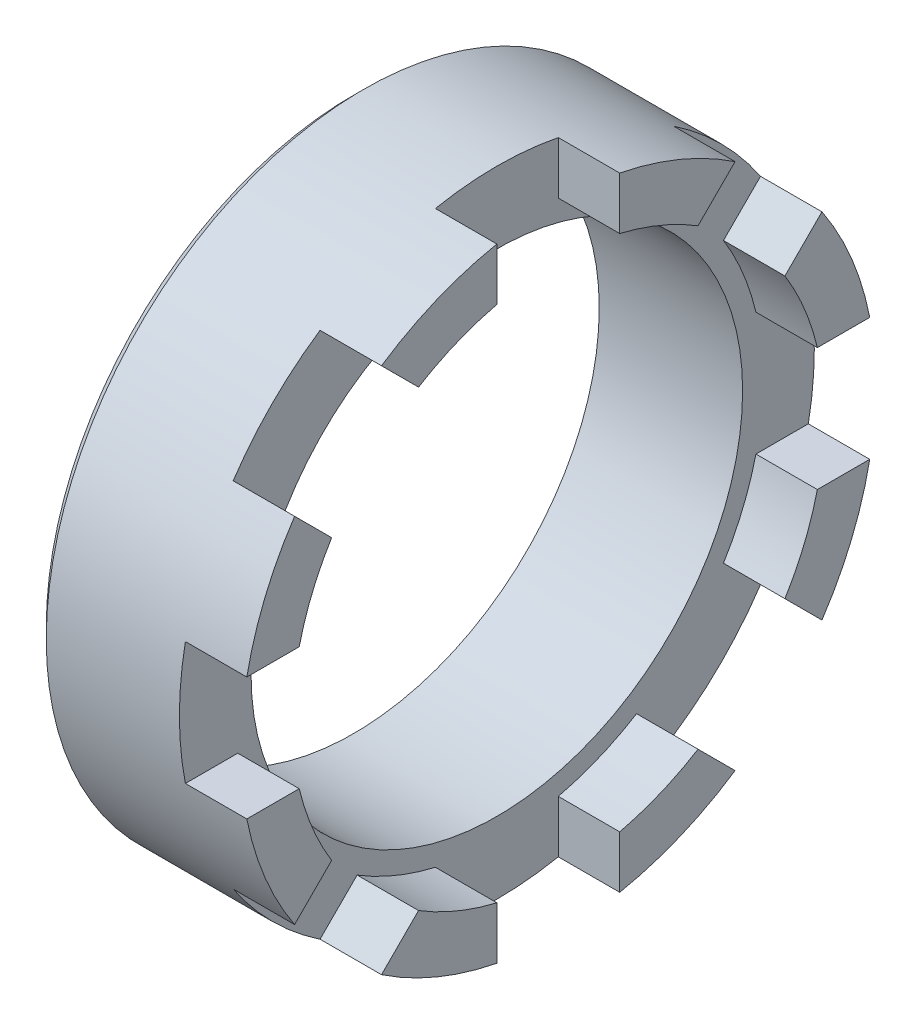
ISO-10303-21;
HEADER;
FILE_DESCRIPTION(('STEP AP214'),'2;1');
FILE_NAME('part.step','',(''),(''),'','','');
FILE_SCHEMA(('AUTOMOTIVE_DESIGN { 1 0 10303 214 1 1 1 1 }'));
ENDSEC;
DATA;
#1=APPLICATION_CONTEXT('core data for automotive mechanical design processes');
#2=APPLICATION_PROTOCOL_DEFINITION('international standard','automotive_design',2000,#1);
#3=PRODUCT_CONTEXT('',#1,'mechanical');
#4=PRODUCT('Part','Part','',(#3));
#5=PRODUCT_RELATED_PRODUCT_CATEGORY('part','',(#4));
#6=PRODUCT_DEFINITION_FORMATION('','',#4);
#7=PRODUCT_DEFINITION_CONTEXT('part definition',#1,'design');
#8=PRODUCT_DEFINITION('design','',#6,#7);
#9=PRODUCT_DEFINITION_SHAPE('','',#8);
#10=(LENGTH_UNIT() NAMED_UNIT(*) SI_UNIT(.MILLI.,.METRE.));
#11=(NAMED_UNIT(*) PLANE_ANGLE_UNIT() SI_UNIT($,.RADIAN.));
#12=(NAMED_UNIT(*) SI_UNIT($,.STERADIAN.) SOLID_ANGLE_UNIT());
#13=UNCERTAINTY_MEASURE_WITH_UNIT(LENGTH_MEASURE(1.E-05),#10,'distance_accuracy_value','');
#14=(GEOMETRIC_REPRESENTATION_CONTEXT(3) GLOBAL_UNCERTAINTY_ASSIGNED_CONTEXT((#13)) GLOBAL_UNIT_ASSIGNED_CONTEXT((#10,
#11,#12)) REPRESENTATION_CONTEXT('',''));
#15=CARTESIAN_POINT('',(0.,0.,0.));
#16=DIRECTION('',(0.,0.,1.));
#17=DIRECTION('',(1.,0.,0.));
#18=AXIS2_PLACEMENT_3D('',#15,#16,#17);
#19=CARTESIAN_POINT('',(-2.,0.,0.));
#20=DIRECTION('',(-1.,0.,0.));
#21=DIRECTION('',(0.,0.,1.));
#22=AXIS2_PLACEMENT_3D('',#19,#20,#21);
#23=CYLINDRICAL_SURFACE('',#22,15.5);
#24=CARTESIAN_POINT('',(0.499999999999983,0.,0.));
#25=DIRECTION('',(-1.,0.,0.));
#26=DIRECTION('',(0.,0.,1.));
#27=AXIS2_PLACEMENT_3D('',#24,#25,#26);
#28=CIRCLE('',#27,15.5);
#29=CARTESIAN_POINT('',(0.499999999999983,0.,15.5));
#30=VERTEX_POINT('',#29);
#31=EDGE_CURVE('E341',#30,#30,#28,.T.);
#32=ORIENTED_EDGE('',*,*,#31,.F.);
#33=EDGE_LOOP('',(#32));
#34=FACE_BOUND('',#33,.T.);
#35=CARTESIAN_POINT('',(7.00000000000001,0.,0.));
#36=DIRECTION('',(-1.,0.,0.));
#37=DIRECTION('',(0.,0.,1.));
#38=AXIS2_PLACEMENT_3D('',#35,#36,#37);
#39=CIRCLE('',#38,15.5);
#40=CARTESIAN_POINT('',(7.00000000000001,12.8742269273629,8.63158624024366));
#41=VERTEX_POINT('',#40);
#42=CARTESIAN_POINT('',(7.00000000000001,8.63158624024361,12.8742269273629));
#43=VERTEX_POINT('',#42);
#44=EDGE_CURVE('E273',#41,#43,#39,.F.);
#45=ORIENTED_EDGE('',*,*,#44,.F.);
#46=DIRECTION('',(-1.,0.,0.));
#47=VECTOR('',#46,1.);
#48=CARTESIAN_POINT('',(-2.,12.8742269273629,8.63158624024366));
#49=LINE('',#48,#47);
#50=CARTESIAN_POINT('',(10.,12.8742269273629,8.63158624024366));
#51=VERTEX_POINT('',#50);
#52=EDGE_CURVE('E277',#41,#51,#49,.F.);
#53=ORIENTED_EDGE('',*,*,#52,.T.);
#54=CARTESIAN_POINT('',(10.,0.,0.));
#55=DIRECTION('',(-1.,0.,0.));
#56=DIRECTION('',(0.,0.,1.));
#57=AXIS2_PLACEMENT_3D('',#54,#55,#56);
#58=CIRCLE('',#57,15.5);
#59=CARTESIAN_POINT('',(10.,15.2069063257455,3.));
#60=VERTEX_POINT('',#59);
#61=EDGE_CURVE('E446',#51,#60,#58,.T.);
#62=ORIENTED_EDGE('',*,*,#61,.T.);
#63=DIRECTION('',(-1.,0.,0.));
#64=VECTOR('',#63,1.);
#65=CARTESIAN_POINT('',(-2.,15.2069063257455,3.));
#66=LINE('',#65,#64);
#67=CARTESIAN_POINT('',(7.00000000000001,15.2069063257455,3.));
#68=VERTEX_POINT('',#67);
#69=EDGE_CURVE('E297',#68,#60,#66,.F.);
#70=ORIENTED_EDGE('',*,*,#69,.F.);
#71=CARTESIAN_POINT('',(7.00000000000001,0.,0.));
#72=DIRECTION('',(-1.,0.,0.));
#73=DIRECTION('',(0.,0.,1.));
#74=AXIS2_PLACEMENT_3D('',#71,#72,#73);
#75=CIRCLE('',#74,15.5);
#76=CARTESIAN_POINT('',(7.00000000000001,15.2069063257455,-3.));
#77=VERTEX_POINT('',#76);
#78=EDGE_CURVE('E316',#77,#68,#75,.F.);
#79=ORIENTED_EDGE('',*,*,#78,.F.);
#80=DIRECTION('',(-1.,0.,0.));
#81=VECTOR('',#80,1.);
#82=CARTESIAN_POINT('',(-2.,15.2069063257455,-3.));
#83=LINE('',#82,#81);
#84=CARTESIAN_POINT('',(10.,15.2069063257455,-3.));
#85=VERTEX_POINT('',#84);
#86=EDGE_CURVE('E313',#77,#85,#83,.F.);
#87=ORIENTED_EDGE('',*,*,#86,.T.);
#88=CARTESIAN_POINT('',(10.,12.874226927363,-8.63158624024357));
#89=VERTEX_POINT('',#88);
#90=EDGE_CURVE('E340',#85,#89,#58,.T.);
#91=ORIENTED_EDGE('',*,*,#90,.T.);
#92=DIRECTION('',(-1.,0.,0.));
#93=VECTOR('',#92,1.);
#94=CARTESIAN_POINT('',(-2.,12.874226927363,-8.63158624024357));
#95=LINE('',#94,#93);
#96=CARTESIAN_POINT('',(7.00000000000001,12.874226927363,-8.63158624024357));
#97=VERTEX_POINT('',#96);
#98=EDGE_CURVE('E268',#89,#97,#95,.T.);
#99=ORIENTED_EDGE('',*,*,#98,.T.);
#100=CARTESIAN_POINT('',(7.00000000000001,8.63158624024371,-12.8742269273629));
#101=VERTEX_POINT('',#100);
#102=EDGE_CURVE('E257',#101,#97,#39,.F.);
#103=ORIENTED_EDGE('',*,*,#102,.F.);
#104=DIRECTION('',(-1.,0.,0.));
#105=VECTOR('',#104,1.);
#106=CARTESIAN_POINT('',(-2.,8.6315862402437,-12.8742269273629));
#107=LINE('',#106,#105);
#108=CARTESIAN_POINT('',(10.,8.6315862402437,-12.8742269273629));
#109=VERTEX_POINT('',#108);
#110=EDGE_CURVE('E240',#109,#101,#107,.T.);
#111=ORIENTED_EDGE('',*,*,#110,.F.);
#112=CARTESIAN_POINT('',(10.,3.00000000000006,-15.2069063257455));
#113=VERTEX_POINT('',#112);
#114=EDGE_CURVE('E449',#109,#113,#58,.T.);
#115=ORIENTED_EDGE('',*,*,#114,.T.);
#116=DIRECTION('',(-1.,0.,0.));
#117=VECTOR('',#116,1.);
#118=CARTESIAN_POINT('',(-2.,3.00000000000006,-15.2069063257455));
#119=LINE('',#118,#117);
#120=CARTESIAN_POINT('',(7.00000000000001,3.00000000000006,-15.2069063257455));
#121=VERTEX_POINT('',#120);
#122=EDGE_CURVE('E443',#113,#121,#119,.T.);
#123=ORIENTED_EDGE('',*,*,#122,.T.);
#124=CARTESIAN_POINT('',(7.00000000000001,-2.99999999999995,-15.2069063257456));
#125=VERTEX_POINT('',#124);
#126=EDGE_CURVE('E269',#125,#121,#39,.F.);
#127=ORIENTED_EDGE('',*,*,#126,.F.);
#128=DIRECTION('',(-1.,0.,0.));
#129=VECTOR('',#128,1.);
#130=CARTESIAN_POINT('',(-2.,-2.99999999999995,-15.2069063257456));
#131=LINE('',#130,#129);
#132=CARTESIAN_POINT('',(10.,-2.99999999999995,-15.2069063257456));
#133=VERTEX_POINT('',#132);
#134=EDGE_CURVE('E554',#133,#125,#131,.T.);
#135=ORIENTED_EDGE('',*,*,#134,.F.);
#136=CARTESIAN_POINT('',(10.,-8.63158624024361,-12.8742269273629));
#137=VERTEX_POINT('',#136);
#138=EDGE_CURVE('E617',#133,#137,#58,.T.);
#139=ORIENTED_EDGE('',*,*,#138,.T.);
#140=DIRECTION('',(-1.,0.,0.));
#141=VECTOR('',#140,1.);
#142=CARTESIAN_POINT('',(-2.,-8.63158624024361,-12.8742269273629));
#143=LINE('',#142,#141);
#144=CARTESIAN_POINT('',(7.00000000000001,-8.63158624024361,-12.8742269273629));
#145=VERTEX_POINT('',#144);
#146=EDGE_CURVE('E515',#137,#145,#143,.T.);
#147=ORIENTED_EDGE('',*,*,#146,.T.);
#148=CARTESIAN_POINT('',(7.00000000000001,-12.8742269273629,-8.63158624024366));
#149=VERTEX_POINT('',#148);
#150=EDGE_CURVE('E272',#149,#145,#39,.F.);
#151=ORIENTED_EDGE('',*,*,#150,.F.);
#152=DIRECTION('',(-1.,0.,0.));
#153=VECTOR('',#152,1.);
#154=CARTESIAN_POINT('',(-2.,-12.8742269273629,-8.63158624024366));
#155=LINE('',#154,#153);
#156=CARTESIAN_POINT('',(10.,-12.8742269273629,-8.63158624024366));
#157=VERTEX_POINT('',#156);
#158=EDGE_CURVE('E523',#157,#149,#155,.T.);
#159=ORIENTED_EDGE('',*,*,#158,.F.);
#160=CARTESIAN_POINT('',(10.,-15.2069063257455,-3.));
#161=VERTEX_POINT('',#160);
#162=EDGE_CURVE('E338',#157,#161,#58,.T.);
#163=ORIENTED_EDGE('',*,*,#162,.T.);
#164=DIRECTION('',(-1.,0.,0.));
#165=VECTOR('',#164,1.);
#166=CARTESIAN_POINT('',(-2.,-15.2069063257455,-3.));
#167=LINE('',#166,#165);
#168=CARTESIAN_POINT('',(7.00000000000001,-15.2069063257455,-3.));
#169=VERTEX_POINT('',#168);
#170=EDGE_CURVE('E306',#161,#169,#167,.T.);
#171=ORIENTED_EDGE('',*,*,#170,.T.);
#172=CARTESIAN_POINT('',(7.00000000000001,-15.2069063257455,3.));
#173=VERTEX_POINT('',#172);
#174=EDGE_CURVE('E318',#173,#169,#75,.F.);
#175=ORIENTED_EDGE('',*,*,#174,.F.);
#176=DIRECTION('',(-1.,0.,0.));
#177=VECTOR('',#176,1.);
#178=CARTESIAN_POINT('',(-2.,-15.2069063257455,3.));
#179=LINE('',#178,#177);
#180=CARTESIAN_POINT('',(10.,-15.2069063257455,3.));
#181=VERTEX_POINT('',#180);
#182=EDGE_CURVE('E291',#181,#173,#179,.T.);
#183=ORIENTED_EDGE('',*,*,#182,.F.);
#184=CARTESIAN_POINT('',(10.,-12.874226927363,8.63158624024357));
#185=VERTEX_POINT('',#184);
#186=EDGE_CURVE('E335',#181,#185,#58,.T.);
#187=ORIENTED_EDGE('',*,*,#186,.T.);
#188=DIRECTION('',(-1.,0.,0.));
#189=VECTOR('',#188,1.);
#190=CARTESIAN_POINT('',(-2.,-12.874226927363,8.63158624024357));
#191=LINE('',#190,#189);
#192=CARTESIAN_POINT('',(7.00000000000001,-12.874226927363,8.63158624024357));
#193=VERTEX_POINT('',#192);
#194=EDGE_CURVE('E542',#193,#185,#191,.F.);
#195=ORIENTED_EDGE('',*,*,#194,.F.);
#196=CARTESIAN_POINT('',(7.00000000000001,-8.63158624024371,12.8742269273629));
#197=VERTEX_POINT('',#196);
#198=EDGE_CURVE('E270',#197,#193,#39,.F.);
#199=ORIENTED_EDGE('',*,*,#198,.F.);
#200=DIRECTION('',(-1.,0.,0.));
#201=VECTOR('',#200,1.);
#202=CARTESIAN_POINT('',(-2.,-8.6315862402437,12.8742269273629));
#203=LINE('',#202,#201);
#204=CARTESIAN_POINT('',(10.,-8.6315862402437,12.8742269273629));
#205=VERTEX_POINT('',#204);
#206=EDGE_CURVE('E529',#197,#205,#203,.F.);
#207=ORIENTED_EDGE('',*,*,#206,.T.);
#208=CARTESIAN_POINT('',(10.,-3.00000000000006,15.2069063257455));
#209=VERTEX_POINT('',#208);
#210=EDGE_CURVE('E339',#205,#209,#58,.T.);
#211=ORIENTED_EDGE('',*,*,#210,.T.);
#212=DIRECTION('',(-1.,0.,0.));
#213=VECTOR('',#212,1.);
#214=CARTESIAN_POINT('',(-2.,-3.00000000000006,15.2069063257455));
#215=LINE('',#214,#213);
#216=CARTESIAN_POINT('',(7.00000000000001,-3.00000000000006,15.2069063257455));
#217=VERTEX_POINT('',#216);
#218=EDGE_CURVE('E536',#217,#209,#215,.F.);
#219=ORIENTED_EDGE('',*,*,#218,.F.);
#220=CARTESIAN_POINT('',(7.00000000000001,2.99999999999995,15.2069063257456));
#221=VERTEX_POINT('',#220);
#222=EDGE_CURVE('E274',#221,#217,#39,.F.);
#223=ORIENTED_EDGE('',*,*,#222,.F.);
#224=DIRECTION('',(-1.,0.,0.));
#225=VECTOR('',#224,1.);
#226=CARTESIAN_POINT('',(-2.,2.99999999999995,15.2069063257456));
#227=LINE('',#226,#225);
#228=CARTESIAN_POINT('',(10.,2.99999999999995,15.2069063257456));
#229=VERTEX_POINT('',#228);
#230=EDGE_CURVE('E547',#221,#229,#227,.F.);
#231=ORIENTED_EDGE('',*,*,#230,.T.);
#232=CARTESIAN_POINT('',(10.,8.63158624024361,12.8742269273629));
#233=VERTEX_POINT('',#232);
#234=EDGE_CURVE('E448',#229,#233,#58,.T.);
#235=ORIENTED_EDGE('',*,*,#234,.T.);
#236=DIRECTION('',(-1.,0.,0.));
#237=VECTOR('',#236,1.);
#238=CARTESIAN_POINT('',(-2.,8.63158624024361,12.8742269273629));
#239=LINE('',#238,#237);
#240=EDGE_CURVE('E506',#43,#233,#239,.F.);
#241=ORIENTED_EDGE('',*,*,#240,.F.);
#242=EDGE_LOOP('',(#45,#53,#62,#70,#79,#87,#91,#99,#103,#111,#115,#123,#127,#135,#139,#147,#151,
#159,#163,#171,#175,#183,#187,#195,#199,#207,#211,#219,#223,#231,#235,#241));
#243=FACE_BOUND('',#242,.T.);
#244=ADVANCED_FACE('F32',(#34,#243),#23,.T.);
#245=CARTESIAN_POINT('',(10.,15.5,0.));
#246=DIRECTION('',(1.,0.,0.));
#247=DIRECTION('',(0.,0.,-1.));
#248=AXIS2_PLACEMENT_3D('',#245,#246,#247);
#249=PLANE('',#248);
#250=CARTESIAN_POINT('',(10.,0.,0.));
#251=DIRECTION('',(-1.,0.,0.));
#252=DIRECTION('',(0.,0.,1.));
#253=AXIS2_PLACEMENT_3D('',#250,#251,#252);
#254=CIRCLE('',#253,13.);
#255=CARTESIAN_POINT('',(10.,-2.99999999999996,-12.6491106406735));
#256=VERTEX_POINT('',#255);
#257=CARTESIAN_POINT('',(10.,-6.8229515664395,-11.0655922535588));
#258=VERTEX_POINT('',#257);
#259=EDGE_CURVE('E451',#256,#258,#254,.T.);
#260=ORIENTED_EDGE('',*,*,#259,.T.);
#261=DIRECTION('',(0.,-0.707106781186546,-0.707106781186549));
#262=VECTOR('',#261,1.);
#263=CARTESIAN_POINT('',(10.,9.87132034355962,5.62867965644036));
#264=LINE('',#263,#262);
#265=EDGE_CURVE('E518',#258,#137,#264,.T.);
#266=ORIENTED_EDGE('',*,*,#265,.T.);
#267=ORIENTED_EDGE('',*,*,#138,.F.);
#268=DIRECTION('',(0.,0.,-1.));
#269=VECTOR('',#268,1.);
#270=CARTESIAN_POINT('',(10.,-3.00000000000001,0.));
#271=LINE('',#270,#269);
#272=EDGE_CURVE('E556',#256,#133,#271,.T.);
#273=ORIENTED_EDGE('',*,*,#272,.F.);
#274=EDGE_LOOP('',(#260,#266,#267,#273));
#275=FACE_BOUND('',#274,.T.);
#276=ADVANCED_FACE('F361',(#275),#249,.T.);
#277=CARTESIAN_POINT('',(10.,12.6491106406735,-3.));
#278=VERTEX_POINT('',#277);
#279=CARTESIAN_POINT('',(10.,11.0655922535588,-6.82295156643947));
#280=VERTEX_POINT('',#279);
#281=EDGE_CURVE('E334',#278,#280,#254,.T.);
#282=ORIENTED_EDGE('',*,*,#281,.T.);
#283=DIRECTION('',(0.,0.707106781186551,-0.707106781186544));
#284=VECTOR('',#283,1.);
#285=CARTESIAN_POINT('',(10.,9.87132034355971,-5.62867965644034));
#286=LINE('',#285,#284);
#287=EDGE_CURVE('E431',#280,#89,#286,.T.);
#288=ORIENTED_EDGE('',*,*,#287,.T.);
#289=ORIENTED_EDGE('',*,*,#90,.F.);
#290=DIRECTION('',(0.,-1.,0.));
#291=VECTOR('',#290,1.);
#292=CARTESIAN_POINT('',(10.,15.5,-3.));
#293=LINE('',#292,#291);
#294=EDGE_CURVE('E307',#85,#278,#293,.T.);
#295=ORIENTED_EDGE('',*,*,#294,.T.);
#296=EDGE_LOOP('',(#282,#288,#289,#295));
#297=FACE_BOUND('',#296,.T.);
#298=ADVANCED_FACE('F369',(#297),#249,.T.);
#299=CARTESIAN_POINT('',(10.,6.82295156643958,-11.0655922535588));
#300=VERTEX_POINT('',#299);
#301=CARTESIAN_POINT('',(10.,3.00000000000005,-12.6491106406735));
#302=VERTEX_POINT('',#301);
#303=EDGE_CURVE('E447',#300,#302,#254,.T.);
#304=ORIENTED_EDGE('',*,*,#303,.T.);
#305=DIRECTION('',(0.,0.,-1.));
#306=VECTOR('',#305,1.);
#307=CARTESIAN_POINT('',(10.,3.,0.));
#308=LINE('',#307,#306);
#309=EDGE_CURVE('E47',#302,#113,#308,.T.);
#310=ORIENTED_EDGE('',*,*,#309,.T.);
#311=ORIENTED_EDGE('',*,*,#114,.F.);
#312=DIRECTION('',(0.,0.707106781186551,-0.707106781186544));
#313=VECTOR('',#312,1.);
#314=CARTESIAN_POINT('',(10.,5.62867965644045,-9.87132034355966));
#315=LINE('',#314,#313);
#316=EDGE_CURVE('E246',#300,#109,#315,.T.);
#317=ORIENTED_EDGE('',*,*,#316,.F.);
#318=EDGE_LOOP('',(#304,#310,#311,#317));
#319=FACE_BOUND('',#318,.T.);
#320=ADVANCED_FACE('F647',(#319),#249,.T.);
#321=CARTESIAN_POINT('',(-2.,0.,0.));
#322=DIRECTION('',(-1.,0.,0.));
#323=DIRECTION('',(0.,0.,1.));
#324=AXIS2_PLACEMENT_3D('',#321,#322,#323);
#325=CYLINDRICAL_SURFACE('',#324,13.);
#326=CARTESIAN_POINT('',(7.00000000000001,0.,0.));
#327=DIRECTION('',(-1.,0.,0.));
#328=DIRECTION('',(0.,0.,1.));
#329=AXIS2_PLACEMENT_3D('',#326,#327,#328);
#330=CIRCLE('',#329,13.);
#331=CARTESIAN_POINT('',(7.00000000000001,-2.99999999999996,-12.6491106406735));
#332=VERTEX_POINT('',#331);
#333=CARTESIAN_POINT('',(7.00000000000001,-6.82295156643951,-11.0655922535588));
#334=VERTEX_POINT('',#333);
#335=EDGE_CURVE('E469',#332,#334,#330,.T.);
#336=ORIENTED_EDGE('',*,*,#335,.T.);
#337=DIRECTION('',(-1.,0.,0.));
#338=VECTOR('',#337,1.);
#339=CARTESIAN_POINT('',(-2.,-6.8229515664395,-11.0655922535588));
#340=LINE('',#339,#338);
#341=EDGE_CURVE('E521',#334,#258,#340,.F.);
#342=ORIENTED_EDGE('',*,*,#341,.T.);
#343=ORIENTED_EDGE('',*,*,#259,.F.);
#344=DIRECTION('',(-1.,0.,0.));
#345=VECTOR('',#344,1.);
#346=CARTESIAN_POINT('',(-2.,-2.99999999999996,-12.6491106406735));
#347=LINE('',#346,#345);
#348=EDGE_CURVE('E558',#332,#256,#347,.F.);
#349=ORIENTED_EDGE('',*,*,#348,.F.);
#350=EDGE_LOOP('',(#336,#342,#343,#349));
#351=FACE_BOUND('',#350,.T.);
#352=ADVANCED_FACE('F376',(#351),#325,.F.);
#353=CARTESIAN_POINT('',(7.00000000000001,12.6491106406735,-3.));
#354=VERTEX_POINT('',#353);
#355=CARTESIAN_POINT('',(7.00000000000001,11.0655922535589,-6.82295156643947));
#356=VERTEX_POINT('',#355);
#357=EDGE_CURVE('E328',#354,#356,#330,.T.);
#358=ORIENTED_EDGE('',*,*,#357,.T.);
#359=DIRECTION('',(-1.,0.,0.));
#360=VECTOR('',#359,1.);
#361=CARTESIAN_POINT('',(-2.,11.0655922535588,-6.82295156643947));
#362=LINE('',#361,#360);
#363=EDGE_CURVE('E433',#356,#280,#362,.F.);
#364=ORIENTED_EDGE('',*,*,#363,.T.);
#365=ORIENTED_EDGE('',*,*,#281,.F.);
#366=DIRECTION('',(-1.,0.,0.));
#367=VECTOR('',#366,1.);
#368=CARTESIAN_POINT('',(-2.,12.6491106406735,-3.));
#369=LINE('',#368,#367);
#370=EDGE_CURVE('E310',#278,#354,#369,.T.);
#371=ORIENTED_EDGE('',*,*,#370,.T.);
#372=EDGE_LOOP('',(#358,#364,#365,#371));
#373=FACE_BOUND('',#372,.T.);
#374=ADVANCED_FACE('F441',(#373),#325,.F.);
#375=CARTESIAN_POINT('',(7.00000000000001,6.82295156643958,-11.0655922535588));
#376=VERTEX_POINT('',#375);
#377=CARTESIAN_POINT('',(7.00000000000001,3.00000000000005,-12.6491106406735));
#378=VERTEX_POINT('',#377);
#379=EDGE_CURVE('E261',#376,#378,#330,.T.);
#380=ORIENTED_EDGE('',*,*,#379,.T.);
#381=DIRECTION('',(-1.,0.,0.));
#382=VECTOR('',#381,1.);
#383=CARTESIAN_POINT('',(-2.,3.00000000000005,-12.6491106406735));
#384=LINE('',#383,#382);
#385=EDGE_CURVE('E251',#378,#302,#384,.F.);
#386=ORIENTED_EDGE('',*,*,#385,.T.);
#387=ORIENTED_EDGE('',*,*,#303,.F.);
#388=DIRECTION('',(-1.,0.,0.));
#389=VECTOR('',#388,1.);
#390=CARTESIAN_POINT('',(-2.,6.82295156643958,-11.0655922535588));
#391=LINE('',#390,#389);
#392=EDGE_CURVE('E566',#376,#300,#391,.F.);
#393=ORIENTED_EDGE('',*,*,#392,.F.);
#394=EDGE_LOOP('',(#380,#386,#387,#393));
#395=FACE_BOUND('',#394,.T.);
#396=ADVANCED_FACE('F638',(#395),#325,.F.);
#397=ORIENTED_EDGE('',*,*,#61,.F.);
#398=DIRECTION('',(0.,-0.707106781186546,-0.707106781186549));
#399=VECTOR('',#398,1.);
#400=CARTESIAN_POINT('',(10.,9.87132034355962,5.62867965644036));
#401=LINE('',#400,#399);
#402=CARTESIAN_POINT('',(10.,11.0655922535588,6.82295156643954));
#403=VERTEX_POINT('',#402);
#404=EDGE_CURVE('E505',#51,#403,#401,.T.);
#405=ORIENTED_EDGE('',*,*,#404,.T.);
#406=CARTESIAN_POINT('',(10.,12.6491106406735,3.));
#407=VERTEX_POINT('',#406);
#408=EDGE_CURVE('E452',#403,#407,#254,.T.);
#409=ORIENTED_EDGE('',*,*,#408,.T.);
#410=DIRECTION('',(0.,-1.,0.));
#411=VECTOR('',#410,1.);
#412=CARTESIAN_POINT('',(10.,15.5,3.));
#413=LINE('',#412,#411);
#414=EDGE_CURVE('E292',#60,#407,#413,.T.);
#415=ORIENTED_EDGE('',*,*,#414,.F.);
#416=EDGE_LOOP('',(#397,#405,#409,#415));
#417=FACE_BOUND('',#416,.T.);
#418=ADVANCED_FACE('F504',(#417),#249,.T.);
#419=ORIENTED_EDGE('',*,*,#210,.F.);
#420=DIRECTION('',(0.,0.707106781186551,-0.707106781186544));
#421=VECTOR('',#420,1.);
#422=CARTESIAN_POINT('',(10.,9.87132034355971,-5.62867965644034));
#423=LINE('',#422,#421);
#424=CARTESIAN_POINT('',(10.,-6.82295156643958,11.0655922535588));
#425=VERTEX_POINT('',#424);
#426=EDGE_CURVE('E532',#205,#425,#423,.T.);
#427=ORIENTED_EDGE('',*,*,#426,.T.);
#428=CARTESIAN_POINT('',(10.,-3.00000000000005,12.6491106406735));
#429=VERTEX_POINT('',#428);
#430=EDGE_CURVE('E333',#425,#429,#254,.T.);
#431=ORIENTED_EDGE('',*,*,#430,.T.);
#432=DIRECTION('',(0.,0.,-1.));
#433=VECTOR('',#432,1.);
#434=CARTESIAN_POINT('',(10.,-3.00000000000001,0.));
#435=LINE('',#434,#433);
#436=EDGE_CURVE('E538',#209,#429,#435,.T.);
#437=ORIENTED_EDGE('',*,*,#436,.F.);
#438=EDGE_LOOP('',(#419,#427,#431,#437));
#439=FACE_BOUND('',#438,.T.);
#440=ADVANCED_FACE('F631',(#439),#249,.T.);
#441=DIRECTION('',(0.,-0.707106781186546,-0.707106781186549));
#442=VECTOR('',#441,1.);
#443=CARTESIAN_POINT('',(10.,5.62867965644032,9.87132034355964));
#444=LINE('',#443,#442);
#445=CARTESIAN_POINT('',(10.,6.8229515664395,11.0655922535588));
#446=VERTEX_POINT('',#445);
#447=EDGE_CURVE('E510',#233,#446,#444,.T.);
#448=ORIENTED_EDGE('',*,*,#447,.F.);
#449=ORIENTED_EDGE('',*,*,#234,.F.);
#450=DIRECTION('',(0.,0.,-1.));
#451=VECTOR('',#450,1.);
#452=CARTESIAN_POINT('',(10.,3.,0.));
#453=LINE('',#452,#451);
#454=CARTESIAN_POINT('',(10.,2.99999999999996,12.6491106406735));
#455=VERTEX_POINT('',#454);
#456=EDGE_CURVE('E550',#229,#455,#453,.T.);
#457=ORIENTED_EDGE('',*,*,#456,.T.);
#458=EDGE_CURVE('E454',#455,#446,#254,.T.);
#459=ORIENTED_EDGE('',*,*,#458,.T.);
#460=EDGE_LOOP('',(#448,#449,#457,#459));
#461=FACE_BOUND('',#460,.T.);
#462=ADVANCED_FACE('F626',(#461),#249,.T.);
#463=ORIENTED_EDGE('',*,*,#408,.F.);
#464=DIRECTION('',(-1.,0.,0.));
#465=VECTOR('',#464,1.);
#466=CARTESIAN_POINT('',(-2.,11.0655922535588,6.82295156643954));
#467=LINE('',#466,#465);
#468=CARTESIAN_POINT('',(7.00000000000001,11.0655922535588,6.82295156643954));
#469=VERTEX_POINT('',#468);
#470=EDGE_CURVE('E496',#403,#469,#467,.T.);
#471=ORIENTED_EDGE('',*,*,#470,.T.);
#472=CARTESIAN_POINT('',(7.00000000000001,12.6491106406735,3.));
#473=VERTEX_POINT('',#472);
#474=EDGE_CURVE('E322',#469,#473,#330,.T.);
#475=ORIENTED_EDGE('',*,*,#474,.T.);
#476=DIRECTION('',(-1.,0.,0.));
#477=VECTOR('',#476,1.);
#478=CARTESIAN_POINT('',(-2.,12.6491106406735,3.));
#479=LINE('',#478,#477);
#480=EDGE_CURVE('E294',#407,#473,#479,.T.);
#481=ORIENTED_EDGE('',*,*,#480,.F.);
#482=EDGE_LOOP('',(#463,#471,#475,#481));
#483=FACE_BOUND('',#482,.T.);
#484=ADVANCED_FACE('F495',(#483),#325,.F.);
#485=ORIENTED_EDGE('',*,*,#430,.F.);
#486=DIRECTION('',(-1.,0.,0.));
#487=VECTOR('',#486,1.);
#488=CARTESIAN_POINT('',(-2.,-6.82295156643958,11.0655922535588));
#489=LINE('',#488,#487);
#490=CARTESIAN_POINT('',(7.00000000000001,-6.82295156643958,11.0655922535588));
#491=VERTEX_POINT('',#490);
#492=EDGE_CURVE('E534',#425,#491,#489,.T.);
#493=ORIENTED_EDGE('',*,*,#492,.T.);
#494=CARTESIAN_POINT('',(7.00000000000001,-3.00000000000005,12.6491106406735));
#495=VERTEX_POINT('',#494);
#496=EDGE_CURVE('E327',#491,#495,#330,.T.);
#497=ORIENTED_EDGE('',*,*,#496,.T.);
#498=DIRECTION('',(-1.,0.,0.));
#499=VECTOR('',#498,1.);
#500=CARTESIAN_POINT('',(-2.,-3.00000000000005,12.6491106406735));
#501=LINE('',#500,#499);
#502=EDGE_CURVE('E540',#429,#495,#501,.T.);
#503=ORIENTED_EDGE('',*,*,#502,.F.);
#504=EDGE_LOOP('',(#485,#493,#497,#503));
#505=FACE_BOUND('',#504,.T.);
#506=ADVANCED_FACE('F632',(#505),#325,.F.);
#507=DIRECTION('',(-1.,0.,0.));
#508=VECTOR('',#507,1.);
#509=CARTESIAN_POINT('',(-2.,6.8229515664395,11.0655922535588));
#510=LINE('',#509,#508);
#511=CARTESIAN_POINT('',(7.00000000000001,6.8229515664395,11.0655922535588));
#512=VERTEX_POINT('',#511);
#513=EDGE_CURVE('E512',#446,#512,#510,.T.);
#514=ORIENTED_EDGE('',*,*,#513,.F.);
#515=ORIENTED_EDGE('',*,*,#458,.F.);
#516=DIRECTION('',(-1.,0.,0.));
#517=VECTOR('',#516,1.);
#518=CARTESIAN_POINT('',(-2.,2.99999999999996,12.6491106406735));
#519=LINE('',#518,#517);
#520=CARTESIAN_POINT('',(7.00000000000001,2.99999999999996,12.6491106406735));
#521=VERTEX_POINT('',#520);
#522=EDGE_CURVE('E552',#455,#521,#519,.T.);
#523=ORIENTED_EDGE('',*,*,#522,.T.);
#524=EDGE_CURVE('E481',#521,#512,#330,.T.);
#525=ORIENTED_EDGE('',*,*,#524,.T.);
#526=EDGE_LOOP('',(#514,#515,#523,#525));
#527=FACE_BOUND('',#526,.T.);
#528=ADVANCED_FACE('F628',(#527),#325,.F.);
#529=DIRECTION('',(0.,-0.707106781186546,-0.707106781186549));
#530=VECTOR('',#529,1.);
#531=CARTESIAN_POINT('',(10.,5.62867965644032,9.87132034355964));
#532=LINE('',#531,#530);
#533=CARTESIAN_POINT('',(10.,-11.0655922535588,-6.82295156643954));
#534=VERTEX_POINT('',#533);
#535=EDGE_CURVE('E525',#534,#157,#532,.T.);
#536=ORIENTED_EDGE('',*,*,#535,.F.);
#537=CARTESIAN_POINT('',(10.,-12.6491106406735,-3.));
#538=VERTEX_POINT('',#537);
#539=EDGE_CURVE('E332',#534,#538,#254,.T.);
#540=ORIENTED_EDGE('',*,*,#539,.T.);
#541=EDGE_CURVE('E303',#538,#161,#293,.T.);
#542=ORIENTED_EDGE('',*,*,#541,.T.);
#543=ORIENTED_EDGE('',*,*,#162,.F.);
#544=EDGE_LOOP('',(#536,#540,#542,#543));
#545=FACE_BOUND('',#544,.T.);
#546=ADVANCED_FACE('F362',(#545),#249,.T.);
#547=DIRECTION('',(-1.,0.,0.));
#548=VECTOR('',#547,1.);
#549=CARTESIAN_POINT('',(-2.,-11.0655922535588,-6.82295156643954));
#550=LINE('',#549,#548);
#551=CARTESIAN_POINT('',(7.00000000000001,-11.0655922535588,-6.82295156643954));
#552=VERTEX_POINT('',#551);
#553=EDGE_CURVE('E527',#552,#534,#550,.F.);
#554=ORIENTED_EDGE('',*,*,#553,.F.);
#555=CARTESIAN_POINT('',(7.00000000000001,-12.6491106406735,-3.));
#556=VERTEX_POINT('',#555);
#557=EDGE_CURVE('E326',#552,#556,#330,.T.);
#558=ORIENTED_EDGE('',*,*,#557,.T.);
#559=DIRECTION('',(-1.,0.,0.));
#560=VECTOR('',#559,1.);
#561=CARTESIAN_POINT('',(-2.,-12.6491106406735,-3.));
#562=LINE('',#561,#560);
#563=EDGE_CURVE('E300',#556,#538,#562,.F.);
#564=ORIENTED_EDGE('',*,*,#563,.T.);
#565=ORIENTED_EDGE('',*,*,#539,.F.);
#566=EDGE_LOOP('',(#554,#558,#564,#565));
#567=FACE_BOUND('',#566,.T.);
#568=ADVANCED_FACE('F377',(#567),#325,.F.);
#569=CARTESIAN_POINT('',(-2.,0.,0.));
#570=DIRECTION('',(-1.,0.,0.));
#571=DIRECTION('',(0.,0.,1.));
#572=AXIS2_PLACEMENT_3D('',#569,#570,#571);
#573=CYLINDRICAL_SURFACE('',#572,12.);
#574=CARTESIAN_POINT('',(0.,0.,0.));
#575=DIRECTION('',(-1.,0.,0.));
#576=DIRECTION('',(0.,0.,1.));
#577=AXIS2_PLACEMENT_3D('',#574,#575,#576);
#578=CIRCLE('',#577,12.);
#579=CARTESIAN_POINT('',(0.,0.,12.));
#580=VERTEX_POINT('',#579);
#581=EDGE_CURVE('E11',#580,#580,#578,.T.);
#582=ORIENTED_EDGE('',*,*,#581,.T.);
#583=EDGE_LOOP('',(#582));
#584=FACE_BOUND('',#583,.T.);
#585=CARTESIAN_POINT('',(7.00000000000001,0.,0.));
#586=DIRECTION('',(-1.,0.,0.));
#587=DIRECTION('',(0.,0.,1.));
#588=AXIS2_PLACEMENT_3D('',#585,#586,#587);
#589=CIRCLE('',#588,12.);
#590=CARTESIAN_POINT('',(7.00000000000001,0.,12.));
#591=VERTEX_POINT('',#590);
#592=EDGE_CURVE('E319',#591,#591,#589,.T.);
#593=ORIENTED_EDGE('',*,*,#592,.F.);
#594=EDGE_LOOP('',(#593));
#595=FACE_BOUND('',#594,.T.);
#596=ADVANCED_FACE('F34',(#584,#595),#573,.F.);
#597=CARTESIAN_POINT('',(0.,12.,0.));
#598=DIRECTION('',(-1.,0.,0.));
#599=DIRECTION('',(0.,0.,1.));
#600=AXIS2_PLACEMENT_3D('',#597,#598,#599);
#601=PLANE('',#600);
#602=CARTESIAN_POINT('',(0.,0.,0.));
#603=DIRECTION('',(-1.,0.,0.));
#604=DIRECTION('',(0.,0.,1.));
#605=AXIS2_PLACEMENT_3D('',#602,#603,#604);
#606=CIRCLE('',#605,15.);
#607=CARTESIAN_POINT('',(0.,0.,15.));
#608=VERTEX_POINT('',#607);
#609=EDGE_CURVE('E40',#608,#608,#606,.T.);
#610=ORIENTED_EDGE('',*,*,#609,.T.);
#611=EDGE_LOOP('',(#610));
#612=FACE_BOUND('',#611,.T.);
#613=ORIENTED_EDGE('',*,*,#581,.F.);
#614=EDGE_LOOP('',(#613));
#615=FACE_BOUND('',#614,.T.);
#616=ADVANCED_FACE('F346',(#612,#615),#601,.T.);
#617=CARTESIAN_POINT('',(0.,0.,0.));
#618=DIRECTION('',(1.,0.,0.));
#619=DIRECTION('',(0.,0.,-1.));
#620=AXIS2_PLACEMENT_3D('',#617,#618,#619);
#621=CONICAL_SURFACE('',#620,15.,0.785398163397448);
#622=ORIENTED_EDGE('',*,*,#31,.T.);
#623=EDGE_LOOP('',(#622));
#624=FACE_BOUND('',#623,.T.);
#625=ORIENTED_EDGE('',*,*,#609,.F.);
#626=EDGE_LOOP('',(#625));
#627=FACE_BOUND('',#626,.T.);
#628=ADVANCED_FACE('F349',(#624,#627),#621,.T.);
#629=DIRECTION('',(0.,0.707106781186551,-0.707106781186544));
#630=VECTOR('',#629,1.);
#631=CARTESIAN_POINT('',(10.,5.62867965644045,-9.87132034355966));
#632=LINE('',#631,#630);
#633=CARTESIAN_POINT('',(10.,-11.0655922535589,6.82295156643947));
#634=VERTEX_POINT('',#633);
#635=EDGE_CURVE('E55',#185,#634,#632,.T.);
#636=ORIENTED_EDGE('',*,*,#635,.F.);
#637=ORIENTED_EDGE('',*,*,#186,.F.);
#638=CARTESIAN_POINT('',(10.,-12.6491106406735,3.));
#639=VERTEX_POINT('',#638);
#640=EDGE_CURVE('E289',#639,#181,#413,.T.);
#641=ORIENTED_EDGE('',*,*,#640,.F.);
#642=EDGE_CURVE('E329',#639,#634,#254,.T.);
#643=ORIENTED_EDGE('',*,*,#642,.T.);
#644=EDGE_LOOP('',(#636,#637,#641,#643));
#645=FACE_BOUND('',#644,.T.);
#646=ADVANCED_FACE('F351',(#645),#249,.T.);
#647=DIRECTION('',(-1.,0.,0.));
#648=VECTOR('',#647,1.);
#649=CARTESIAN_POINT('',(-2.,-11.0655922535588,6.82295156643947));
#650=LINE('',#649,#648);
#651=CARTESIAN_POINT('',(7.00000000000001,-11.0655922535588,6.82295156643946));
#652=VERTEX_POINT('',#651);
#653=EDGE_CURVE('E545',#634,#652,#650,.T.);
#654=ORIENTED_EDGE('',*,*,#653,.F.);
#655=ORIENTED_EDGE('',*,*,#642,.F.);
#656=DIRECTION('',(-1.,0.,0.));
#657=VECTOR('',#656,1.);
#658=CARTESIAN_POINT('',(-2.,-12.6491106406735,3.));
#659=LINE('',#658,#657);
#660=CARTESIAN_POINT('',(7.00000000000001,-12.6491106406735,3.));
#661=VERTEX_POINT('',#660);
#662=EDGE_CURVE('E287',#661,#639,#659,.F.);
#663=ORIENTED_EDGE('',*,*,#662,.F.);
#664=EDGE_CURVE('E323',#661,#652,#330,.T.);
#665=ORIENTED_EDGE('',*,*,#664,.T.);
#666=EDGE_LOOP('',(#654,#655,#663,#665));
#667=FACE_BOUND('',#666,.T.);
#668=ADVANCED_FACE('F358',(#667),#325,.F.);
#669=CARTESIAN_POINT('',(7.00000000000001,13.,0.));
#670=DIRECTION('',(1.,0.,0.));
#671=DIRECTION('',(0.,0.,-1.));
#672=AXIS2_PLACEMENT_3D('',#669,#670,#671);
#673=PLANE('',#672);
#674=ORIENTED_EDGE('',*,*,#592,.T.);
#675=EDGE_LOOP('',(#674));
#676=FACE_BOUND('',#675,.T.);
#677=ORIENTED_EDGE('',*,*,#379,.F.);
#678=DIRECTION('',(0.,-0.707106781186551,0.707106781186544));
#679=VECTOR('',#678,1.);
#680=CARTESIAN_POINT('',(7.00000000000001,13.3786796564404,-17.6213203435596));
#681=LINE('',#680,#679);
#682=EDGE_CURVE('E243',#101,#376,#681,.T.);
#683=ORIENTED_EDGE('',*,*,#682,.F.);
#684=ORIENTED_EDGE('',*,*,#102,.T.);
#685=DIRECTION('',(0.,-0.707106781186551,0.707106781186544));
#686=VECTOR('',#685,1.);
#687=CARTESIAN_POINT('',(7.00000000000001,17.6213203435597,-13.3786796564403));
#688=LINE('',#687,#686);
#689=EDGE_CURVE('E583',#97,#356,#688,.T.);
#690=ORIENTED_EDGE('',*,*,#689,.T.);
#691=ORIENTED_EDGE('',*,*,#357,.F.);
#692=DIRECTION('',(0.,1.,0.));
#693=VECTOR('',#692,1.);
#694=CARTESIAN_POINT('',(7.00000000000001,-15.5,-3.));
#695=LINE('',#694,#693);
#696=EDGE_CURVE('E283',#354,#77,#695,.T.);
#697=ORIENTED_EDGE('',*,*,#696,.T.);
#698=ORIENTED_EDGE('',*,*,#78,.T.);
#699=DIRECTION('',(0.,1.,0.));
#700=VECTOR('',#699,1.);
#701=CARTESIAN_POINT('',(7.00000000000001,-15.5,3.));
#702=LINE('',#701,#700);
#703=EDGE_CURVE('E279',#473,#68,#702,.T.);
#704=ORIENTED_EDGE('',*,*,#703,.F.);
#705=ORIENTED_EDGE('',*,*,#474,.F.);
#706=DIRECTION('',(0.,0.707106781186546,0.707106781186549));
#707=VECTOR('',#706,1.);
#708=CARTESIAN_POINT('',(7.00000000000001,-13.3786796564403,-17.6213203435597));
#709=LINE('',#708,#707);
#710=EDGE_CURVE('E569',#469,#41,#709,.T.);
#711=ORIENTED_EDGE('',*,*,#710,.T.);
#712=ORIENTED_EDGE('',*,*,#44,.T.);
#713=DIRECTION('',(0.,0.707106781186546,0.707106781186549));
#714=VECTOR('',#713,1.);
#715=CARTESIAN_POINT('',(7.00000000000001,-17.6213203435596,-13.3786796564404));
#716=LINE('',#715,#714);
#717=EDGE_CURVE('E572',#512,#43,#716,.T.);
#718=ORIENTED_EDGE('',*,*,#717,.F.);
#719=ORIENTED_EDGE('',*,*,#524,.F.);
#720=DIRECTION('',(0.,0.,1.));
#721=VECTOR('',#720,1.);
#722=CARTESIAN_POINT('',(7.00000000000001,3.00000000000006,-15.5));
#723=LINE('',#722,#721);
#724=EDGE_CURVE('E576',#521,#221,#723,.T.);
#725=ORIENTED_EDGE('',*,*,#724,.T.);
#726=ORIENTED_EDGE('',*,*,#222,.T.);
#727=DIRECTION('',(0.,0.,1.));
#728=VECTOR('',#727,1.);
#729=CARTESIAN_POINT('',(7.00000000000001,-2.99999999999995,-15.5000000000001));
#730=LINE('',#729,#728);
#731=EDGE_CURVE('E580',#495,#217,#730,.T.);
#732=ORIENTED_EDGE('',*,*,#731,.F.);
#733=ORIENTED_EDGE('',*,*,#496,.F.);
#734=EDGE_CURVE('E262',#491,#197,#688,.T.);
#735=ORIENTED_EDGE('',*,*,#734,.T.);
#736=ORIENTED_EDGE('',*,*,#198,.T.);
#737=EDGE_CURVE('E263',#652,#193,#681,.T.);
#738=ORIENTED_EDGE('',*,*,#737,.F.);
#739=ORIENTED_EDGE('',*,*,#664,.F.);
#740=EDGE_CURVE('E282',#173,#661,#702,.T.);
#741=ORIENTED_EDGE('',*,*,#740,.F.);
#742=ORIENTED_EDGE('',*,*,#174,.T.);
#743=EDGE_CURVE('E286',#169,#556,#695,.T.);
#744=ORIENTED_EDGE('',*,*,#743,.T.);
#745=ORIENTED_EDGE('',*,*,#557,.F.);
#746=EDGE_CURVE('E571',#149,#552,#716,.T.);
#747=ORIENTED_EDGE('',*,*,#746,.F.);
#748=ORIENTED_EDGE('',*,*,#150,.T.);
#749=EDGE_CURVE('E568',#145,#334,#709,.T.);
#750=ORIENTED_EDGE('',*,*,#749,.T.);
#751=ORIENTED_EDGE('',*,*,#335,.F.);
#752=EDGE_CURVE('E579',#125,#332,#730,.T.);
#753=ORIENTED_EDGE('',*,*,#752,.F.);
#754=ORIENTED_EDGE('',*,*,#126,.T.);
#755=EDGE_CURVE('E575',#121,#378,#723,.T.);
#756=ORIENTED_EDGE('',*,*,#755,.T.);
#757=EDGE_LOOP('',(#677,#683,#684,#690,#691,#697,#698,#704,#705,#711,#712,#718,#719,#725,#726,
#732,#733,#735,#736,#738,#739,#741,#742,#744,#745,#747,#748,#750,#751,#753,#754,#756));
#758=FACE_BOUND('',#757,.T.);
#759=ADVANCED_FACE('F255',(#676,#758),#673,.T.);
#760=CARTESIAN_POINT('',(7.00000000000001,-15.5,-3.));
#761=DIRECTION('',(0.,0.,1.));
#762=DIRECTION('',(1.,0.,0.));
#763=AXIS2_PLACEMENT_3D('',#760,#761,#762);
#764=PLANE('',#763);
#765=ORIENTED_EDGE('',*,*,#541,.F.);
#766=ORIENTED_EDGE('',*,*,#563,.F.);
#767=ORIENTED_EDGE('',*,*,#743,.F.);
#768=ORIENTED_EDGE('',*,*,#170,.F.);
#769=EDGE_LOOP('',(#765,#766,#767,#768));
#770=FACE_BOUND('',#769,.T.);
#771=ADVANCED_FACE('F380',(#770),#764,.T.);
#772=CARTESIAN_POINT('',(7.00000000000001,-15.5,3.));
#773=DIRECTION('',(0.,0.,1.));
#774=DIRECTION('',(1.,0.,0.));
#775=AXIS2_PLACEMENT_3D('',#772,#773,#774);
#776=PLANE('',#775);
#777=ORIENTED_EDGE('',*,*,#182,.T.);
#778=ORIENTED_EDGE('',*,*,#740,.T.);
#779=ORIENTED_EDGE('',*,*,#662,.T.);
#780=ORIENTED_EDGE('',*,*,#640,.T.);
#781=EDGE_LOOP('',(#777,#778,#779,#780));
#782=FACE_BOUND('',#781,.T.);
#783=ADVANCED_FACE('F384',(#782),#776,.F.);
#784=ORIENTED_EDGE('',*,*,#696,.F.);
#785=ORIENTED_EDGE('',*,*,#370,.F.);
#786=ORIENTED_EDGE('',*,*,#294,.F.);
#787=ORIENTED_EDGE('',*,*,#86,.F.);
#788=EDGE_LOOP('',(#784,#785,#786,#787));
#789=FACE_BOUND('',#788,.T.);
#790=ADVANCED_FACE('F386',(#789),#764,.T.);
#791=ORIENTED_EDGE('',*,*,#69,.T.);
#792=ORIENTED_EDGE('',*,*,#414,.T.);
#793=ORIENTED_EDGE('',*,*,#480,.T.);
#794=ORIENTED_EDGE('',*,*,#703,.T.);
#795=EDGE_LOOP('',(#791,#792,#793,#794));
#796=FACE_BOUND('',#795,.T.);
#797=ADVANCED_FACE('F390',(#796),#776,.F.);
#798=CARTESIAN_POINT('',(7.00000000000001,-2.99999999999995,-15.5000000000001));
#799=DIRECTION('',(0.,-1.,0.));
#800=DIRECTION('',(0.,0.,-1.));
#801=AXIS2_PLACEMENT_3D('',#798,#799,#800);
#802=PLANE('',#801);
#803=ORIENTED_EDGE('',*,*,#218,.T.);
#804=ORIENTED_EDGE('',*,*,#436,.T.);
#805=ORIENTED_EDGE('',*,*,#502,.T.);
#806=ORIENTED_EDGE('',*,*,#731,.T.);
#807=EDGE_LOOP('',(#803,#804,#805,#806));
#808=FACE_BOUND('',#807,.T.);
#809=ADVANCED_FACE('F409',(#808),#802,.F.);
#810=CARTESIAN_POINT('',(7.00000000000001,3.00000000000006,-15.5));
#811=DIRECTION('',(0.,-1.,0.));
#812=DIRECTION('',(0.,0.,-1.));
#813=AXIS2_PLACEMENT_3D('',#810,#811,#812);
#814=PLANE('',#813);
#815=ORIENTED_EDGE('',*,*,#724,.F.);
#816=ORIENTED_EDGE('',*,*,#522,.F.);
#817=ORIENTED_EDGE('',*,*,#456,.F.);
#818=ORIENTED_EDGE('',*,*,#230,.F.);
#819=EDGE_LOOP('',(#815,#816,#817,#818));
#820=FACE_BOUND('',#819,.T.);
#821=ADVANCED_FACE('F405',(#820),#814,.T.);
#822=CARTESIAN_POINT('',(7.00000000000001,13.3786796564404,-17.6213203435596));
#823=DIRECTION('',(0.,-0.707106781186544,-0.707106781186551));
#824=DIRECTION('',(0.,0.707106781186551,-0.707106781186544));
#825=AXIS2_PLACEMENT_3D('',#822,#823,#824);
#826=PLANE('',#825);
#827=ORIENTED_EDGE('',*,*,#194,.T.);
#828=ORIENTED_EDGE('',*,*,#635,.T.);
#829=ORIENTED_EDGE('',*,*,#653,.T.);
#830=ORIENTED_EDGE('',*,*,#737,.T.);
#831=EDGE_LOOP('',(#827,#828,#829,#830));
#832=FACE_BOUND('',#831,.T.);
#833=ADVANCED_FACE('F413',(#832),#826,.F.);
#834=CARTESIAN_POINT('',(7.00000000000001,17.6213203435597,-13.3786796564403));
#835=DIRECTION('',(0.,-0.707106781186544,-0.707106781186551));
#836=DIRECTION('',(0.,0.707106781186551,-0.707106781186544));
#837=AXIS2_PLACEMENT_3D('',#834,#835,#836);
#838=PLANE('',#837);
#839=ORIENTED_EDGE('',*,*,#734,.F.);
#840=ORIENTED_EDGE('',*,*,#492,.F.);
#841=ORIENTED_EDGE('',*,*,#426,.F.);
#842=ORIENTED_EDGE('',*,*,#206,.F.);
#843=EDGE_LOOP('',(#839,#840,#841,#842));
#844=FACE_BOUND('',#843,.T.);
#845=ADVANCED_FACE('F410',(#844),#838,.T.);
#846=CARTESIAN_POINT('',(7.00000000000001,-17.6213203435596,-13.3786796564404));
#847=DIRECTION('',(0.,-0.707106781186549,0.707106781186546));
#848=DIRECTION('',(0.,-0.707106781186546,-0.707106781186549));
#849=AXIS2_PLACEMENT_3D('',#846,#847,#848);
#850=PLANE('',#849);
#851=ORIENTED_EDGE('',*,*,#240,.T.);
#852=ORIENTED_EDGE('',*,*,#447,.T.);
#853=ORIENTED_EDGE('',*,*,#513,.T.);
#854=ORIENTED_EDGE('',*,*,#717,.T.);
#855=EDGE_LOOP('',(#851,#852,#853,#854));
#856=FACE_BOUND('',#855,.T.);
#857=ADVANCED_FACE('F401',(#856),#850,.F.);
#858=CARTESIAN_POINT('',(7.00000000000001,-13.3786796564403,-17.6213203435597));
#859=DIRECTION('',(0.,-0.707106781186549,0.707106781186546));
#860=DIRECTION('',(0.,-0.707106781186546,-0.707106781186549));
#861=AXIS2_PLACEMENT_3D('',#858,#859,#860);
#862=PLANE('',#861);
#863=ORIENTED_EDGE('',*,*,#710,.F.);
#864=ORIENTED_EDGE('',*,*,#470,.F.);
#865=ORIENTED_EDGE('',*,*,#404,.F.);
#866=ORIENTED_EDGE('',*,*,#52,.F.);
#867=EDGE_LOOP('',(#863,#864,#865,#866));
#868=FACE_BOUND('',#867,.T.);
#869=ADVANCED_FACE('F397',(#868),#862,.T.);
#870=ORIENTED_EDGE('',*,*,#287,.F.);
#871=ORIENTED_EDGE('',*,*,#363,.F.);
#872=ORIENTED_EDGE('',*,*,#689,.F.);
#873=ORIENTED_EDGE('',*,*,#98,.F.);
#874=EDGE_LOOP('',(#870,#871,#872,#873));
#875=FACE_BOUND('',#874,.T.);
#876=ADVANCED_FACE('F415',(#875),#838,.T.);
#877=ORIENTED_EDGE('',*,*,#110,.T.);
#878=ORIENTED_EDGE('',*,*,#682,.T.);
#879=ORIENTED_EDGE('',*,*,#392,.T.);
#880=ORIENTED_EDGE('',*,*,#316,.T.);
#881=EDGE_LOOP('',(#877,#878,#879,#880));
#882=FACE_BOUND('',#881,.T.);
#883=ADVANCED_FACE('F242',(#882),#826,.F.);
#884=ORIENTED_EDGE('',*,*,#309,.F.);
#885=ORIENTED_EDGE('',*,*,#385,.F.);
#886=ORIENTED_EDGE('',*,*,#755,.F.);
#887=ORIENTED_EDGE('',*,*,#122,.F.);
#888=EDGE_LOOP('',(#884,#885,#886,#887));
#889=FACE_BOUND('',#888,.T.);
#890=ADVANCED_FACE('F402',(#889),#814,.T.);
#891=ORIENTED_EDGE('',*,*,#134,.T.);
#892=ORIENTED_EDGE('',*,*,#752,.T.);
#893=ORIENTED_EDGE('',*,*,#348,.T.);
#894=ORIENTED_EDGE('',*,*,#272,.T.);
#895=EDGE_LOOP('',(#891,#892,#893,#894));
#896=FACE_BOUND('',#895,.T.);
#897=ADVANCED_FACE('F395',(#896),#802,.F.);
#898=ORIENTED_EDGE('',*,*,#265,.F.);
#899=ORIENTED_EDGE('',*,*,#341,.F.);
#900=ORIENTED_EDGE('',*,*,#749,.F.);
#901=ORIENTED_EDGE('',*,*,#146,.F.);
#902=EDGE_LOOP('',(#898,#899,#900,#901));
#903=FACE_BOUND('',#902,.T.);
#904=ADVANCED_FACE('F391',(#903),#862,.T.);
#905=ORIENTED_EDGE('',*,*,#158,.T.);
#906=ORIENTED_EDGE('',*,*,#746,.T.);
#907=ORIENTED_EDGE('',*,*,#553,.T.);
#908=ORIENTED_EDGE('',*,*,#535,.T.);
#909=EDGE_LOOP('',(#905,#906,#907,#908));
#910=FACE_BOUND('',#909,.T.);
#911=ADVANCED_FACE('F394',(#910),#850,.F.);
#912=CLOSED_SHELL('',(#244,#276,#298,#320,#352,#374,#396,#418,#440,#462,#484,#506,#528,#546,
#568,#596,#616,#628,#646,#668,#759,#771,#783,#790,#797,#809,#821,#833,#845,#857,#869,#876,#883,
#890,#897,#904,#911));
#913=MANIFOLD_SOLID_BREP('B2',#912);
#914=ADVANCED_BREP_SHAPE_REPRESENTATION('',(#18,#913),#14);
#915=SHAPE_DEFINITION_REPRESENTATION(#9,#914);
ENDSEC;
END-ISO-10303-21;
